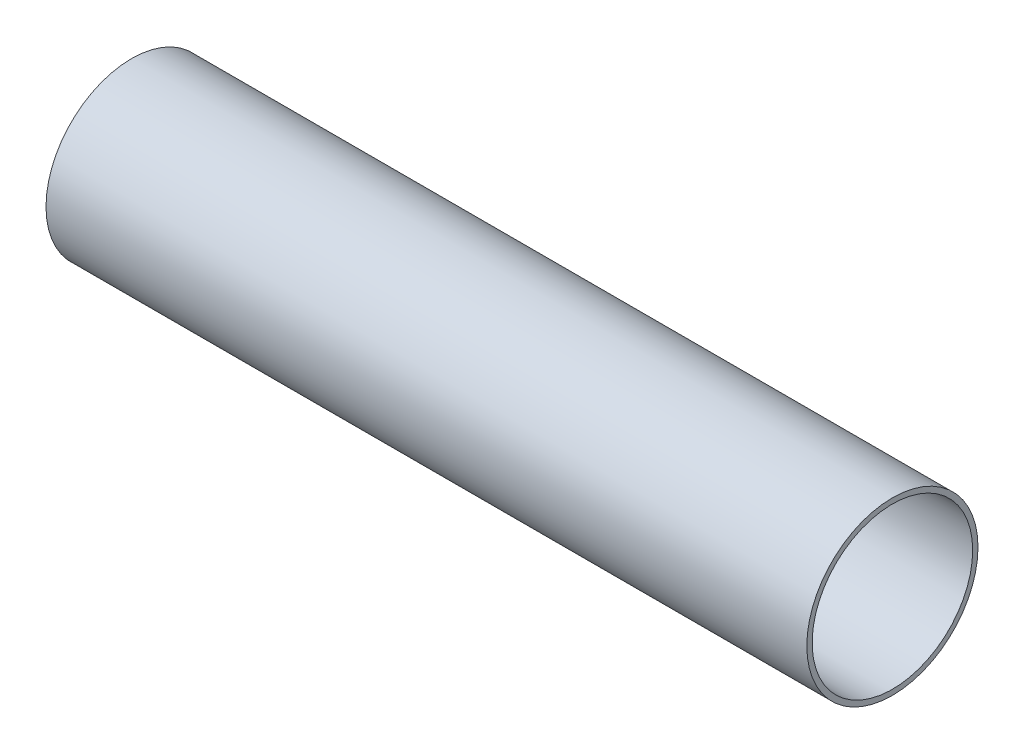
ISO-10303-21;
HEADER;
FILE_DESCRIPTION(('STEP AP214'),'2;1');
FILE_NAME('part.step','',(''),(''),'','','');
FILE_SCHEMA(('AUTOMOTIVE_DESIGN { 1 0 10303 214 1 1 1 1 }'));
ENDSEC;
DATA;
#1=APPLICATION_CONTEXT('core data for automotive mechanical design processes');
#2=APPLICATION_PROTOCOL_DEFINITION('international standard','automotive_design',2000,#1);
#3=PRODUCT_CONTEXT('',#1,'mechanical');
#4=PRODUCT('Part','Part','',(#3));
#5=PRODUCT_RELATED_PRODUCT_CATEGORY('part','',(#4));
#6=PRODUCT_DEFINITION_FORMATION('','',#4);
#7=PRODUCT_DEFINITION_CONTEXT('part definition',#1,'design');
#8=PRODUCT_DEFINITION('design','',#6,#7);
#9=PRODUCT_DEFINITION_SHAPE('','',#8);
#10=(LENGTH_UNIT() NAMED_UNIT(*) SI_UNIT(.MILLI.,.METRE.));
#11=(NAMED_UNIT(*) PLANE_ANGLE_UNIT() SI_UNIT($,.RADIAN.));
#12=(NAMED_UNIT(*) SI_UNIT($,.STERADIAN.) SOLID_ANGLE_UNIT());
#13=UNCERTAINTY_MEASURE_WITH_UNIT(LENGTH_MEASURE(1.E-05),#10,'distance_accuracy_value','');
#14=(GEOMETRIC_REPRESENTATION_CONTEXT(3) GLOBAL_UNCERTAINTY_ASSIGNED_CONTEXT((#13)) GLOBAL_UNIT_ASSIGNED_CONTEXT((#10,
#11,#12)) REPRESENTATION_CONTEXT('',''));
#15=CARTESIAN_POINT('',(0.,0.,0.));
#16=DIRECTION('',(0.,0.,1.));
#17=DIRECTION('',(1.,0.,0.));
#18=AXIS2_PLACEMENT_3D('',#15,#16,#17);
#19=CARTESIAN_POINT('',(63.5,0.,0.));
#20=DIRECTION('',(1.,0.,0.));
#21=DIRECTION('',(0.,0.,-1.));
#22=AXIS2_PLACEMENT_3D('',#19,#20,#21);
#23=PLANE('',#22);
#24=CARTESIAN_POINT('',(63.5,0.,0.));
#25=DIRECTION('',(1.,0.,0.));
#26=DIRECTION('',(0.,0.,-1.));
#27=AXIS2_PLACEMENT_3D('',#24,#25,#26);
#28=CIRCLE('',#27,14.2875);
#29=CARTESIAN_POINT('',(63.5,0.,-14.2875));
#30=VERTEX_POINT('',#29);
#31=EDGE_CURVE('E10',#30,#30,#28,.T.);
#32=ORIENTED_EDGE('',*,*,#31,.T.);
#33=EDGE_LOOP('',(#32));
#34=FACE_BOUND('',#33,.T.);
#35=CARTESIAN_POINT('',(63.5,0.,0.));
#36=DIRECTION('',(1.,0.,0.));
#37=DIRECTION('',(0.,0.,-1.));
#38=AXIS2_PLACEMENT_3D('',#35,#36,#37);
#39=CIRCLE('',#38,13.3985);
#40=CARTESIAN_POINT('',(63.5,0.,-13.3985));
#41=VERTEX_POINT('',#40);
#42=EDGE_CURVE('E42',#41,#41,#39,.T.);
#43=ORIENTED_EDGE('',*,*,#42,.F.);
#44=EDGE_LOOP('',(#43));
#45=FACE_BOUND('',#44,.T.);
#46=ADVANCED_FACE('F31',(#34,#45),#23,.T.);
#47=CARTESIAN_POINT('',(-63.5,0.,0.));
#48=DIRECTION('',(1.,0.,0.));
#49=DIRECTION('',(0.,0.,-1.));
#50=AXIS2_PLACEMENT_3D('',#47,#48,#49);
#51=PLANE('',#50);
#52=CARTESIAN_POINT('',(-63.5,0.,0.));
#53=DIRECTION('',(1.,0.,0.));
#54=DIRECTION('',(0.,0.,-1.));
#55=AXIS2_PLACEMENT_3D('',#52,#53,#54);
#56=CIRCLE('',#55,14.2875);
#57=CARTESIAN_POINT('',(-63.5,0.,-14.2875));
#58=VERTEX_POINT('',#57);
#59=EDGE_CURVE('E35',#58,#58,#56,.T.);
#60=ORIENTED_EDGE('',*,*,#59,.F.);
#61=EDGE_LOOP('',(#60));
#62=FACE_BOUND('',#61,.T.);
#63=CARTESIAN_POINT('',(-63.5,0.,0.));
#64=DIRECTION('',(1.,0.,0.));
#65=DIRECTION('',(0.,0.,-1.));
#66=AXIS2_PLACEMENT_3D('',#63,#64,#65);
#67=CIRCLE('',#66,13.3985);
#68=CARTESIAN_POINT('',(-63.5,0.,-13.3985));
#69=VERTEX_POINT('',#68);
#70=EDGE_CURVE('E44',#69,#69,#67,.T.);
#71=ORIENTED_EDGE('',*,*,#70,.T.);
#72=EDGE_LOOP('',(#71));
#73=FACE_BOUND('',#72,.T.);
#74=ADVANCED_FACE('F54',(#62,#73),#51,.F.);
#75=CARTESIAN_POINT('',(63.5,0.,0.));
#76=DIRECTION('',(-1.,0.,0.));
#77=DIRECTION('',(0.,0.,1.));
#78=AXIS2_PLACEMENT_3D('',#75,#76,#77);
#79=CYLINDRICAL_SURFACE('',#78,14.2875);
#80=ORIENTED_EDGE('',*,*,#31,.F.);
#81=EDGE_LOOP('',(#80));
#82=FACE_BOUND('',#81,.T.);
#83=ORIENTED_EDGE('',*,*,#59,.T.);
#84=EDGE_LOOP('',(#83));
#85=FACE_BOUND('',#84,.T.);
#86=ADVANCED_FACE('F33',(#82,#85),#79,.T.);
#87=CARTESIAN_POINT('',(63.5,0.,0.));
#88=DIRECTION('',(-1.,0.,0.));
#89=DIRECTION('',(0.,0.,1.));
#90=AXIS2_PLACEMENT_3D('',#87,#88,#89);
#91=CYLINDRICAL_SURFACE('',#90,13.3985);
#92=ORIENTED_EDGE('',*,*,#42,.T.);
#93=EDGE_LOOP('',(#92));
#94=FACE_BOUND('',#93,.T.);
#95=ORIENTED_EDGE('',*,*,#70,.F.);
#96=EDGE_LOOP('',(#95));
#97=FACE_BOUND('',#96,.T.);
#98=ADVANCED_FACE('F50',(#94,#97),#91,.F.);
#99=CLOSED_SHELL('',(#46,#74,#86,#98));
#100=MANIFOLD_SOLID_BREP('B2',#99);
#101=ADVANCED_BREP_SHAPE_REPRESENTATION('',(#18,#100),#14);
#102=SHAPE_DEFINITION_REPRESENTATION(#9,#101);
ENDSEC;
END-ISO-10303-21;
